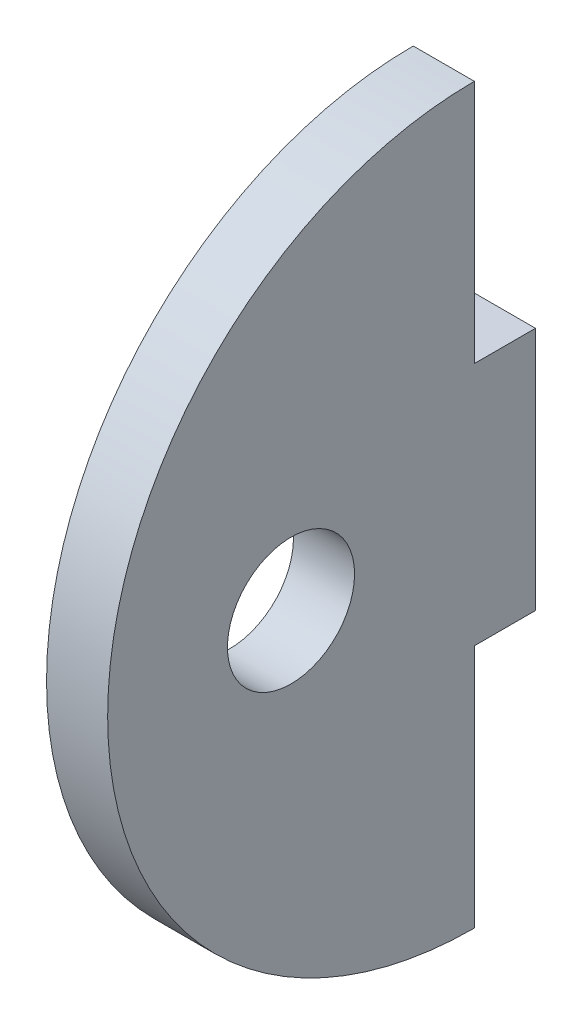
ISO-10303-21;
HEADER;
FILE_DESCRIPTION(('STEP AP214'),'2;1');
FILE_NAME('part.step','',(''),(''),'','','');
FILE_SCHEMA(('AUTOMOTIVE_DESIGN { 1 0 10303 214 1 1 1 1 }'));
ENDSEC;
DATA;
#1=APPLICATION_CONTEXT('core data for automotive mechanical design processes');
#2=APPLICATION_PROTOCOL_DEFINITION('international standard','automotive_design',2000,#1);
#3=PRODUCT_CONTEXT('',#1,'mechanical');
#4=PRODUCT('Part','Part','',(#3));
#5=PRODUCT_RELATED_PRODUCT_CATEGORY('part','',(#4));
#6=PRODUCT_DEFINITION_FORMATION('','',#4);
#7=PRODUCT_DEFINITION_CONTEXT('part definition',#1,'design');
#8=PRODUCT_DEFINITION('design','',#6,#7);
#9=PRODUCT_DEFINITION_SHAPE('','',#8);
#10=(LENGTH_UNIT() NAMED_UNIT(*) SI_UNIT(.MILLI.,.METRE.));
#11=(NAMED_UNIT(*) PLANE_ANGLE_UNIT() SI_UNIT($,.RADIAN.));
#12=(NAMED_UNIT(*) SI_UNIT($,.STERADIAN.) SOLID_ANGLE_UNIT());
#13=UNCERTAINTY_MEASURE_WITH_UNIT(LENGTH_MEASURE(1.E-05),#10,'distance_accuracy_value','');
#14=(GEOMETRIC_REPRESENTATION_CONTEXT(3) GLOBAL_UNCERTAINTY_ASSIGNED_CONTEXT((#13)) GLOBAL_UNIT_ASSIGNED_CONTEXT((#10,
#11,#12)) REPRESENTATION_CONTEXT('',''));
#15=CARTESIAN_POINT('',(0.,0.,0.));
#16=DIRECTION('',(0.,0.,1.));
#17=DIRECTION('',(1.,0.,0.));
#18=AXIS2_PLACEMENT_3D('',#15,#16,#17);
#19=CARTESIAN_POINT('',(5.,20.,5.));
#20=DIRECTION('',(1.,0.,0.));
#21=DIRECTION('',(0.,0.,-1.));
#22=AXIS2_PLACEMENT_3D('',#19,#20,#21);
#23=PLANE('',#22);
#24=DIRECTION('',(0.,0.,-1.));
#25=VECTOR('',#24,1.);
#26=CARTESIAN_POINT('',(5.,30.,5.));
#27=LINE('',#26,#25);
#28=CARTESIAN_POINT('',(5.,30.,5.));
#29=VERTEX_POINT('',#28);
#30=CARTESIAN_POINT('',(5.,30.,0.));
#31=VERTEX_POINT('',#30);
#32=EDGE_CURVE('E162',#29,#31,#27,.T.);
#33=ORIENTED_EDGE('',*,*,#32,.F.);
#34=DIRECTION('',(0.,1.,0.));
#35=VECTOR('',#34,1.);
#36=CARTESIAN_POINT('',(5.,40.,5.));
#37=LINE('',#36,#35);
#38=CARTESIAN_POINT('',(5.,50.,5.));
#39=VERTEX_POINT('',#38);
#40=EDGE_CURVE('E151',#29,#39,#37,.T.);
#41=ORIENTED_EDGE('',*,*,#40,.T.);
#42=CARTESIAN_POINT('',(5.,20.,5.));
#43=DIRECTION('',(1.,0.,0.));
#44=DIRECTION('',(0.,0.,-1.));
#45=AXIS2_PLACEMENT_3D('',#42,#43,#44);
#46=CIRCLE('',#45,30.);
#47=CARTESIAN_POINT('',(5.,-10.,5.));
#48=VERTEX_POINT('',#47);
#49=EDGE_CURVE('E61',#39,#48,#46,.T.);
#50=ORIENTED_EDGE('',*,*,#49,.T.);
#51=DIRECTION('',(0.,1.,0.));
#52=VECTOR('',#51,1.);
#53=CARTESIAN_POINT('',(5.,-10.,5.));
#54=LINE('',#53,#52);
#55=CARTESIAN_POINT('',(5.,10.,5.));
#56=VERTEX_POINT('',#55);
#57=EDGE_CURVE('E138',#48,#56,#54,.T.);
#58=ORIENTED_EDGE('',*,*,#57,.T.);
#59=DIRECTION('',(0.,0.,1.));
#60=VECTOR('',#59,1.);
#61=CARTESIAN_POINT('',(5.,10.,5.));
#62=LINE('',#61,#60);
#63=CARTESIAN_POINT('',(5.,10.,0.));
#64=VERTEX_POINT('',#63);
#65=EDGE_CURVE('E114',#64,#56,#62,.T.);
#66=ORIENTED_EDGE('',*,*,#65,.F.);
#67=DIRECTION('',(0.,1.,0.));
#68=VECTOR('',#67,1.);
#69=CARTESIAN_POINT('',(5.,0.,0.));
#70=LINE('',#69,#68);
#71=EDGE_CURVE('E121',#64,#31,#70,.T.);
#72=ORIENTED_EDGE('',*,*,#71,.T.);
#73=EDGE_LOOP('',(#33,#41,#50,#58,#66,#72));
#74=FACE_BOUND('',#73,.T.);
#75=CARTESIAN_POINT('',(5.,20.,20.));
#76=DIRECTION('',(1.,0.,0.));
#77=DIRECTION('',(0.,0.,-1.));
#78=AXIS2_PLACEMENT_3D('',#75,#76,#77);
#79=CIRCLE('',#78,5.2);
#80=CARTESIAN_POINT('',(5.,20.,14.8));
#81=VERTEX_POINT('',#80);
#82=EDGE_CURVE('E128',#81,#81,#79,.T.);
#83=ORIENTED_EDGE('',*,*,#82,.F.);
#84=EDGE_LOOP('',(#83));
#85=FACE_BOUND('',#84,.T.);
#86=ADVANCED_FACE('F43',(#74,#85),#23,.T.);
#87=CARTESIAN_POINT('',(0.,20.,5.));
#88=DIRECTION('',(1.,0.,0.));
#89=DIRECTION('',(0.,0.,-1.));
#90=AXIS2_PLACEMENT_3D('',#87,#88,#89);
#91=PLANE('',#90);
#92=DIRECTION('',(0.,1.,0.));
#93=VECTOR('',#92,1.);
#94=CARTESIAN_POINT('',(0.,40.,5.));
#95=LINE('',#94,#93);
#96=CARTESIAN_POINT('',(0.,30.,5.));
#97=VERTEX_POINT('',#96);
#98=CARTESIAN_POINT('',(0.,50.,5.));
#99=VERTEX_POINT('',#98);
#100=EDGE_CURVE('E72',#97,#99,#95,.T.);
#101=ORIENTED_EDGE('',*,*,#100,.F.);
#102=DIRECTION('',(0.,0.,-1.));
#103=VECTOR('',#102,1.);
#104=CARTESIAN_POINT('',(0.,30.,5.));
#105=LINE('',#104,#103);
#106=CARTESIAN_POINT('',(0.,30.,0.));
#107=VERTEX_POINT('',#106);
#108=EDGE_CURVE('E126',#97,#107,#105,.T.);
#109=ORIENTED_EDGE('',*,*,#108,.T.);
#110=DIRECTION('',(0.,1.,0.));
#111=VECTOR('',#110,1.);
#112=CARTESIAN_POINT('',(0.,0.,0.));
#113=LINE('',#112,#111);
#114=CARTESIAN_POINT('',(0.,10.,0.));
#115=VERTEX_POINT('',#114);
#116=EDGE_CURVE('E119',#115,#107,#113,.T.);
#117=ORIENTED_EDGE('',*,*,#116,.F.);
#118=DIRECTION('',(0.,0.,1.));
#119=VECTOR('',#118,1.);
#120=CARTESIAN_POINT('',(0.,10.,5.));
#121=LINE('',#120,#119);
#122=CARTESIAN_POINT('',(0.,10.,5.));
#123=VERTEX_POINT('',#122);
#124=EDGE_CURVE('E102',#115,#123,#121,.T.);
#125=ORIENTED_EDGE('',*,*,#124,.T.);
#126=DIRECTION('',(0.,1.,0.));
#127=VECTOR('',#126,1.);
#128=CARTESIAN_POINT('',(0.,-10.,5.));
#129=LINE('',#128,#127);
#130=CARTESIAN_POINT('',(0.,-10.,5.));
#131=VERTEX_POINT('',#130);
#132=EDGE_CURVE('E143',#131,#123,#129,.T.);
#133=ORIENTED_EDGE('',*,*,#132,.F.);
#134=CARTESIAN_POINT('',(0.,20.,5.));
#135=DIRECTION('',(1.,0.,0.));
#136=DIRECTION('',(0.,0.,-1.));
#137=AXIS2_PLACEMENT_3D('',#134,#135,#136);
#138=CIRCLE('',#137,30.);
#139=EDGE_CURVE('E132',#99,#131,#138,.T.);
#140=ORIENTED_EDGE('',*,*,#139,.F.);
#141=EDGE_LOOP('',(#101,#109,#117,#125,#133,#140));
#142=FACE_BOUND('',#141,.T.);
#143=CARTESIAN_POINT('',(0.,20.,20.));
#144=DIRECTION('',(1.,0.,0.));
#145=DIRECTION('',(0.,0.,-1.));
#146=AXIS2_PLACEMENT_3D('',#143,#144,#145);
#147=CIRCLE('',#146,5.2);
#148=CARTESIAN_POINT('',(0.,20.,14.8));
#149=VERTEX_POINT('',#148);
#150=EDGE_CURVE('E135',#149,#149,#147,.T.);
#151=ORIENTED_EDGE('',*,*,#150,.T.);
#152=EDGE_LOOP('',(#151));
#153=FACE_BOUND('',#152,.T.);
#154=ADVANCED_FACE('F124',(#142,#153),#91,.F.);
#155=CARTESIAN_POINT('',(5.,0.,0.));
#156=DIRECTION('',(0.,0.,1.));
#157=DIRECTION('',(1.,0.,0.));
#158=AXIS2_PLACEMENT_3D('',#155,#156,#157);
#159=PLANE('',#158);
#160=ORIENTED_EDGE('',*,*,#116,.T.);
#161=DIRECTION('',(1.,0.,0.));
#162=VECTOR('',#161,1.);
#163=CARTESIAN_POINT('',(0.,30.,0.));
#164=LINE('',#163,#162);
#165=EDGE_CURVE('E81',#107,#31,#164,.T.);
#166=ORIENTED_EDGE('',*,*,#165,.T.);
#167=ORIENTED_EDGE('',*,*,#71,.F.);
#168=DIRECTION('',(1.,0.,0.));
#169=VECTOR('',#168,1.);
#170=CARTESIAN_POINT('',(0.,10.,0.));
#171=LINE('',#170,#169);
#172=EDGE_CURVE('E106',#115,#64,#171,.T.);
#173=ORIENTED_EDGE('',*,*,#172,.F.);
#174=EDGE_LOOP('',(#160,#166,#167,#173));
#175=FACE_BOUND('',#174,.T.);
#176=ADVANCED_FACE('F45',(#175),#159,.F.);
#177=CARTESIAN_POINT('',(5.,40.,5.));
#178=DIRECTION('',(0.,0.,1.));
#179=DIRECTION('',(0.,-1.,0.));
#180=AXIS2_PLACEMENT_3D('',#177,#178,#179);
#181=PLANE('',#180);
#182=ORIENTED_EDGE('',*,*,#100,.T.);
#183=DIRECTION('',(-1.,0.,0.));
#184=VECTOR('',#183,1.);
#185=CARTESIAN_POINT('',(5.,50.,5.));
#186=LINE('',#185,#184);
#187=EDGE_CURVE('E11',#39,#99,#186,.T.);
#188=ORIENTED_EDGE('',*,*,#187,.F.);
#189=ORIENTED_EDGE('',*,*,#40,.F.);
#190=DIRECTION('',(1.,0.,0.));
#191=VECTOR('',#190,1.);
#192=CARTESIAN_POINT('',(0.,30.,5.));
#193=LINE('',#192,#191);
#194=EDGE_CURVE('E165',#97,#29,#193,.T.);
#195=ORIENTED_EDGE('',*,*,#194,.F.);
#196=EDGE_LOOP('',(#182,#188,#189,#195));
#197=FACE_BOUND('',#196,.T.);
#198=ADVANCED_FACE('F192',(#197),#181,.F.);
#199=CARTESIAN_POINT('',(5.,20.,5.));
#200=DIRECTION('',(-1.,0.,0.));
#201=DIRECTION('',(0.,0.,1.));
#202=AXIS2_PLACEMENT_3D('',#199,#200,#201);
#203=CYLINDRICAL_SURFACE('',#202,30.);
#204=ORIENTED_EDGE('',*,*,#139,.T.);
#205=DIRECTION('',(-1.,0.,0.));
#206=VECTOR('',#205,1.);
#207=CARTESIAN_POINT('',(5.,-10.,5.));
#208=LINE('',#207,#206);
#209=EDGE_CURVE('E53',#48,#131,#208,.T.);
#210=ORIENTED_EDGE('',*,*,#209,.F.);
#211=ORIENTED_EDGE('',*,*,#49,.F.);
#212=ORIENTED_EDGE('',*,*,#187,.T.);
#213=EDGE_LOOP('',(#204,#210,#211,#212));
#214=FACE_BOUND('',#213,.T.);
#215=ADVANCED_FACE('F196',(#214),#203,.T.);
#216=CARTESIAN_POINT('',(5.,-10.,5.));
#217=DIRECTION('',(0.,0.,1.));
#218=DIRECTION('',(0.,-1.,0.));
#219=AXIS2_PLACEMENT_3D('',#216,#217,#218);
#220=PLANE('',#219);
#221=ORIENTED_EDGE('',*,*,#132,.T.);
#222=DIRECTION('',(1.,0.,0.));
#223=VECTOR('',#222,1.);
#224=CARTESIAN_POINT('',(0.,10.,5.));
#225=LINE('',#224,#223);
#226=EDGE_CURVE('E109',#123,#56,#225,.T.);
#227=ORIENTED_EDGE('',*,*,#226,.T.);
#228=ORIENTED_EDGE('',*,*,#57,.F.);
#229=ORIENTED_EDGE('',*,*,#209,.T.);
#230=EDGE_LOOP('',(#221,#227,#228,#229));
#231=FACE_BOUND('',#230,.T.);
#232=ADVANCED_FACE('F184',(#231),#220,.F.);
#233=CARTESIAN_POINT('',(5.,20.,20.));
#234=DIRECTION('',(-1.,0.,0.));
#235=DIRECTION('',(0.,0.,1.));
#236=AXIS2_PLACEMENT_3D('',#233,#234,#235);
#237=CYLINDRICAL_SURFACE('',#236,5.2);
#238=ORIENTED_EDGE('',*,*,#82,.T.);
#239=EDGE_LOOP('',(#238));
#240=FACE_BOUND('',#239,.T.);
#241=ORIENTED_EDGE('',*,*,#150,.F.);
#242=EDGE_LOOP('',(#241));
#243=FACE_BOUND('',#242,.T.);
#244=ADVANCED_FACE('F181',(#240,#243),#237,.F.);
#245=CARTESIAN_POINT('',(0.,10.,5.));
#246=DIRECTION('',(0.,1.,0.));
#247=DIRECTION('',(0.,0.,1.));
#248=AXIS2_PLACEMENT_3D('',#245,#246,#247);
#249=PLANE('',#248);
#250=ORIENTED_EDGE('',*,*,#65,.T.);
#251=ORIENTED_EDGE('',*,*,#226,.F.);
#252=ORIENTED_EDGE('',*,*,#124,.F.);
#253=ORIENTED_EDGE('',*,*,#172,.T.);
#254=EDGE_LOOP('',(#250,#251,#252,#253));
#255=FACE_BOUND('',#254,.T.);
#256=ADVANCED_FACE('F105',(#255),#249,.F.);
#257=CARTESIAN_POINT('',(0.,30.,5.));
#258=DIRECTION('',(0.,-1.,0.));
#259=DIRECTION('',(0.,0.,-1.));
#260=AXIS2_PLACEMENT_3D('',#257,#258,#259);
#261=PLANE('',#260);
#262=ORIENTED_EDGE('',*,*,#32,.T.);
#263=ORIENTED_EDGE('',*,*,#165,.F.);
#264=ORIENTED_EDGE('',*,*,#108,.F.);
#265=ORIENTED_EDGE('',*,*,#194,.T.);
#266=EDGE_LOOP('',(#262,#263,#264,#265));
#267=FACE_BOUND('',#266,.T.);
#268=ADVANCED_FACE('F175',(#267),#261,.F.);
#269=CLOSED_SHELL('',(#86,#154,#176,#198,#215,#232,#244,#256,#268));
#270=MANIFOLD_SOLID_BREP('B2',#269);
#271=ADVANCED_BREP_SHAPE_REPRESENTATION('',(#18,#270),#14);
#272=SHAPE_DEFINITION_REPRESENTATION(#9,#271);
ENDSEC;
END-ISO-10303-21;
